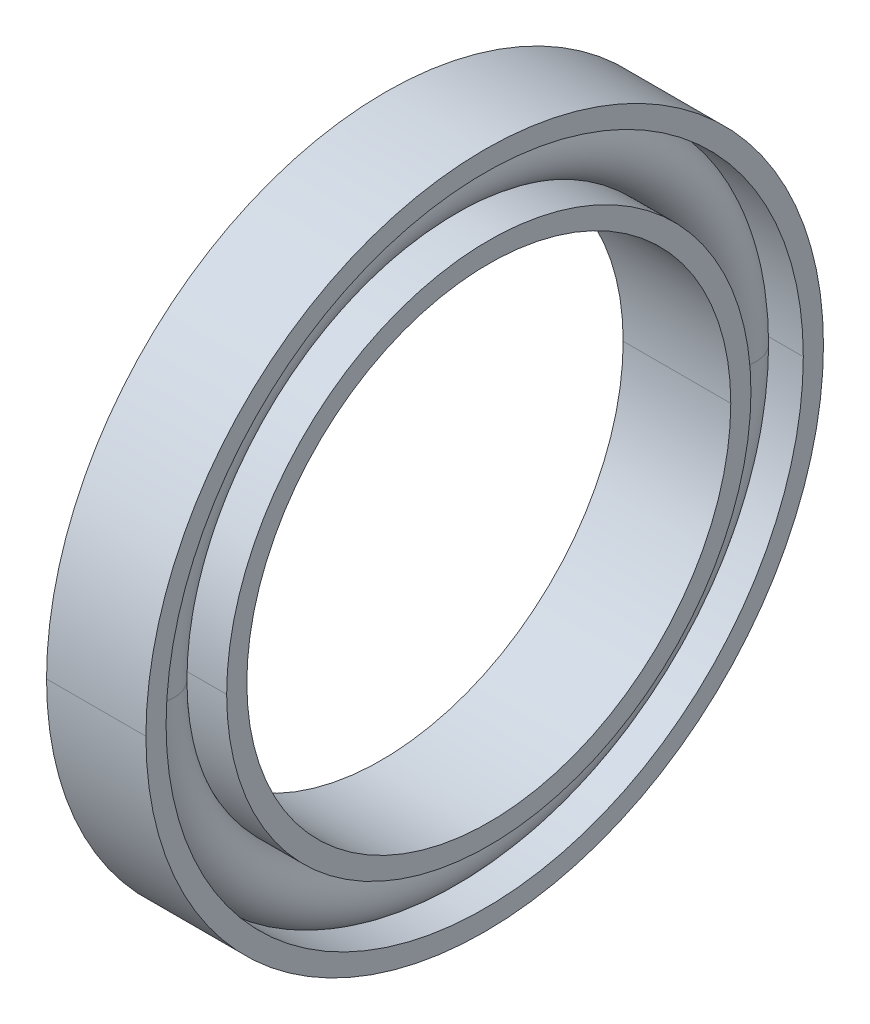
ISO-10303-21;
HEADER;
FILE_DESCRIPTION(('STEP AP214'),'2;1');
FILE_NAME('part.step','',(''),(''),'','','');
FILE_SCHEMA(('AUTOMOTIVE_DESIGN { 1 0 10303 214 1 1 1 1 }'));
ENDSEC;
DATA;
#1=APPLICATION_CONTEXT('core data for automotive mechanical design processes');
#2=APPLICATION_PROTOCOL_DEFINITION('international standard','automotive_design',2000,#1);
#3=PRODUCT_CONTEXT('',#1,'mechanical');
#4=PRODUCT('Part','Part','',(#3));
#5=PRODUCT_RELATED_PRODUCT_CATEGORY('part','',(#4));
#6=PRODUCT_DEFINITION_FORMATION('','',#4);
#7=PRODUCT_DEFINITION_CONTEXT('part definition',#1,'design');
#8=PRODUCT_DEFINITION('design','',#6,#7);
#9=PRODUCT_DEFINITION_SHAPE('','',#8);
#10=(LENGTH_UNIT() NAMED_UNIT(*) SI_UNIT(.MILLI.,.METRE.));
#11=(NAMED_UNIT(*) PLANE_ANGLE_UNIT() SI_UNIT($,.RADIAN.));
#12=(NAMED_UNIT(*) SI_UNIT($,.STERADIAN.) SOLID_ANGLE_UNIT());
#13=UNCERTAINTY_MEASURE_WITH_UNIT(LENGTH_MEASURE(1.E-05),#10,'distance_accuracy_value','');
#14=(GEOMETRIC_REPRESENTATION_CONTEXT(3) GLOBAL_UNCERTAINTY_ASSIGNED_CONTEXT((#13)) GLOBAL_UNIT_ASSIGNED_CONTEXT((#10,
#11,#12)) REPRESENTATION_CONTEXT('',''));
#15=CARTESIAN_POINT('',(0.,0.,0.));
#16=DIRECTION('',(0.,0.,1.));
#17=DIRECTION('',(1.,0.,0.));
#18=AXIS2_PLACEMENT_3D('',#15,#16,#17);
#19=CARTESIAN_POINT('',(0.154999999999996,19.,0.));
#20=DIRECTION('',(-1.,0.,0.));
#21=DIRECTION('',(0.,0.,1.));
#22=AXIS2_PLACEMENT_3D('',#19,#20,#21);
#23=PLANE('',#22);
#24=CARTESIAN_POINT('',(0.154999999999996,0.,0.));
#25=DIRECTION('',(1.,0.,0.));
#26=DIRECTION('',(0.,0.,-1.));
#27=AXIS2_PLACEMENT_3D('',#24,#25,#26);
#28=CIRCLE('',#27,16.5);
#29=CARTESIAN_POINT('',(0.154999999999996,0.,-16.5));
#30=VERTEX_POINT('',#29);
#31=CARTESIAN_POINT('',(0.154999999999996,0.,16.5));
#32=VERTEX_POINT('',#31);
#33=EDGE_CURVE('E27',#30,#32,#28,.T.);
#34=ORIENTED_EDGE('',*,*,#33,.T.);
#35=CARTESIAN_POINT('',(0.154999999999996,0.,0.));
#36=DIRECTION('',(1.,0.,0.));
#37=DIRECTION('',(0.,0.,-1.));
#38=AXIS2_PLACEMENT_3D('',#35,#36,#37);
#39=CIRCLE('',#38,16.5);
#40=EDGE_CURVE('E267',#32,#30,#39,.T.);
#41=ORIENTED_EDGE('',*,*,#40,.T.);
#42=EDGE_LOOP('',(#34,#41));
#43=FACE_BOUND('',#42,.T.);
#44=CARTESIAN_POINT('',(0.154999999999996,0.,0.));
#45=DIRECTION('',(1.,0.,0.));
#46=DIRECTION('',(0.,0.,-1.));
#47=AXIS2_PLACEMENT_3D('',#44,#45,#46);
#48=CIRCLE('',#47,19.);
#49=CARTESIAN_POINT('',(0.154999999999996,0.,-19.));
#50=VERTEX_POINT('',#49);
#51=CARTESIAN_POINT('',(0.154999999999996,0.,19.));
#52=VERTEX_POINT('',#51);
#53=EDGE_CURVE('E304',#50,#52,#48,.T.);
#54=ORIENTED_EDGE('',*,*,#53,.F.);
#55=CARTESIAN_POINT('',(0.154999999999996,0.,0.));
#56=DIRECTION('',(1.,0.,0.));
#57=DIRECTION('',(0.,0.,-1.));
#58=AXIS2_PLACEMENT_3D('',#55,#56,#57);
#59=CIRCLE('',#58,19.);
#60=EDGE_CURVE('E11',#52,#50,#59,.T.);
#61=ORIENTED_EDGE('',*,*,#60,.F.);
#62=EDGE_LOOP('',(#54,#61));
#63=FACE_BOUND('',#62,.T.);
#64=ADVANCED_FACE('F16',(#43,#63),#23,.T.);
#65=CARTESIAN_POINT('',(0.,0.,0.));
#66=DIRECTION('',(1.,0.,0.));
#67=DIRECTION('',(0.,0.,-1.));
#68=AXIS2_PLACEMENT_3D('',#65,#66,#67);
#69=CYLINDRICAL_SURFACE('',#68,19.);
#70=DIRECTION('',(1.,0.,0.));
#71=VECTOR('',#70,1.);
#72=CARTESIAN_POINT('',(0.,0.,19.));
#73=LINE('',#72,#71);
#74=CARTESIAN_POINT('',(1.47600997509336,0.,19.));
#75=VERTEX_POINT('',#74);
#76=EDGE_CURVE('E300',#52,#75,#73,.T.);
#77=ORIENTED_EDGE('',*,*,#76,.F.);
#78=ORIENTED_EDGE('',*,*,#60,.T.);
#79=DIRECTION('',(1.,0.,0.));
#80=VECTOR('',#79,1.);
#81=CARTESIAN_POINT('',(0.,0.,-19.));
#82=LINE('',#81,#80);
#83=CARTESIAN_POINT('',(1.47600997509336,0.,-19.));
#84=VERTEX_POINT('',#83);
#85=EDGE_CURVE('E271',#50,#84,#82,.T.);
#86=ORIENTED_EDGE('',*,*,#85,.T.);
#87=CARTESIAN_POINT('',(1.47600997509336,0.,0.));
#88=DIRECTION('',(1.,0.,0.));
#89=DIRECTION('',(0.,0.,-1.));
#90=AXIS2_PLACEMENT_3D('',#87,#88,#89);
#91=CIRCLE('',#90,19.);
#92=EDGE_CURVE('E158',#75,#84,#91,.T.);
#93=ORIENTED_EDGE('',*,*,#92,.F.);
#94=EDGE_LOOP('',(#77,#78,#86,#93));
#95=FACE_BOUND('',#94,.T.);
#96=ADVANCED_FACE('F350',(#95),#69,.T.);
#97=CARTESIAN_POINT('',(0.,0.,0.));
#98=DIRECTION('',(1.,0.,0.));
#99=DIRECTION('',(0.,0.,-1.));
#100=AXIS2_PLACEMENT_3D('',#97,#98,#99);
#101=CYLINDRICAL_SURFACE('',#100,16.5);
#102=DIRECTION('',(1.,0.,0.));
#103=VECTOR('',#102,1.);
#104=CARTESIAN_POINT('',(0.,0.,16.5));
#105=LINE('',#104,#103);
#106=CARTESIAN_POINT('',(1.9947424268866,0.,16.5));
#107=VERTEX_POINT('',#106);
#108=EDGE_CURVE('E194',#32,#107,#105,.T.);
#109=ORIENTED_EDGE('',*,*,#108,.F.);
#110=ORIENTED_EDGE('',*,*,#33,.F.);
#111=DIRECTION('',(1.,0.,0.));
#112=VECTOR('',#111,1.);
#113=CARTESIAN_POINT('',(0.,0.,-16.5));
#114=LINE('',#113,#112);
#115=CARTESIAN_POINT('',(1.9947424268866,0.,-16.5));
#116=VERTEX_POINT('',#115);
#117=EDGE_CURVE('E272',#30,#116,#114,.T.);
#118=ORIENTED_EDGE('',*,*,#117,.T.);
#119=CARTESIAN_POINT('',(1.9947424268866,0.,0.));
#120=DIRECTION('',(-1.,0.,0.));
#121=DIRECTION('',(0.,0.,-1.));
#122=AXIS2_PLACEMENT_3D('',#119,#120,#121);
#123=CIRCLE('',#122,16.5);
#124=EDGE_CURVE('E166',#107,#116,#123,.T.);
#125=ORIENTED_EDGE('',*,*,#124,.F.);
#126=EDGE_LOOP('',(#109,#110,#118,#125));
#127=FACE_BOUND('',#126,.T.);
#128=ADVANCED_FACE('F356',(#127),#101,.F.);
#129=CARTESIAN_POINT('',(-0.254999999999995,15.,0.));
#130=DIRECTION('',(1.,0.,0.));
#131=DIRECTION('',(0.,1.,0.));
#132=AXIS2_PLACEMENT_3D('',#129,#130,#131);
#133=PLANE('',#132);
#134=CARTESIAN_POINT('',(-0.254999999999995,0.,0.));
#135=DIRECTION('',(-1.,0.,0.));
#136=DIRECTION('',(0.,0.,1.));
#137=AXIS2_PLACEMENT_3D('',#134,#135,#136);
#138=CIRCLE('',#137,15.);
#139=CARTESIAN_POINT('',(-0.254999999999995,0.,15.));
#140=VERTEX_POINT('',#139);
#141=CARTESIAN_POINT('',(-0.254999999999995,0.,-15.));
#142=VERTEX_POINT('',#141);
#143=EDGE_CURVE('E104',#140,#142,#138,.T.);
#144=ORIENTED_EDGE('',*,*,#143,.F.);
#145=CARTESIAN_POINT('',(-0.254999999999995,0.,0.));
#146=DIRECTION('',(-1.,0.,0.));
#147=DIRECTION('',(0.,0.,1.));
#148=AXIS2_PLACEMENT_3D('',#145,#146,#147);
#149=CIRCLE('',#148,15.);
#150=EDGE_CURVE('E295',#142,#140,#149,.T.);
#151=ORIENTED_EDGE('',*,*,#150,.F.);
#152=EDGE_LOOP('',(#144,#151));
#153=FACE_BOUND('',#152,.T.);
#154=CARTESIAN_POINT('',(-0.254999999999995,0.,0.));
#155=DIRECTION('',(-1.,0.,0.));
#156=DIRECTION('',(0.,0.,1.));
#157=AXIS2_PLACEMENT_3D('',#154,#155,#156);
#158=CIRCLE('',#157,16.25);
#159=CARTESIAN_POINT('',(-0.254999999999995,0.,16.25));
#160=VERTEX_POINT('',#159);
#161=CARTESIAN_POINT('',(-0.254999999999995,0.,-16.25));
#162=VERTEX_POINT('',#161);
#163=EDGE_CURVE('E178',#160,#162,#158,.T.);
#164=ORIENTED_EDGE('',*,*,#163,.T.);
#165=CARTESIAN_POINT('',(-0.254999999999995,0.,0.));
#166=DIRECTION('',(-1.,0.,0.));
#167=DIRECTION('',(0.,0.,1.));
#168=AXIS2_PLACEMENT_3D('',#165,#166,#167);
#169=CIRCLE('',#168,16.25);
#170=EDGE_CURVE('E173',#162,#160,#169,.T.);
#171=ORIENTED_EDGE('',*,*,#170,.T.);
#172=EDGE_LOOP('',(#164,#171));
#173=FACE_BOUND('',#172,.T.);
#174=ADVANCED_FACE('F18',(#153,#173),#133,.F.);
#175=CARTESIAN_POINT('',(6.415,15.,0.));
#176=DIRECTION('',(-1.,0.,0.));
#177=DIRECTION('',(0.,0.,1.));
#178=AXIS2_PLACEMENT_3D('',#175,#176,#177);
#179=PLANE('',#178);
#180=CARTESIAN_POINT('',(6.415,0.,0.));
#181=DIRECTION('',(-1.,0.,0.));
#182=DIRECTION('',(0.,0.,1.));
#183=AXIS2_PLACEMENT_3D('',#180,#181,#182);
#184=CIRCLE('',#183,15.);
#185=CARTESIAN_POINT('',(6.415,0.,15.));
#186=VERTEX_POINT('',#185);
#187=CARTESIAN_POINT('',(6.415,0.,-15.));
#188=VERTEX_POINT('',#187);
#189=EDGE_CURVE('E224',#186,#188,#184,.T.);
#190=ORIENTED_EDGE('',*,*,#189,.T.);
#191=CARTESIAN_POINT('',(6.415,0.,0.));
#192=DIRECTION('',(-1.,0.,0.));
#193=DIRECTION('',(0.,0.,1.));
#194=AXIS2_PLACEMENT_3D('',#191,#192,#193);
#195=CIRCLE('',#194,15.);
#196=EDGE_CURVE('E275',#188,#186,#195,.T.);
#197=ORIENTED_EDGE('',*,*,#196,.T.);
#198=EDGE_LOOP('',(#190,#197));
#199=FACE_BOUND('',#198,.T.);
#200=CARTESIAN_POINT('',(6.415,0.,0.));
#201=DIRECTION('',(-1.,0.,0.));
#202=DIRECTION('',(0.,0.,1.));
#203=AXIS2_PLACEMENT_3D('',#200,#201,#202);
#204=CIRCLE('',#203,16.25);
#205=CARTESIAN_POINT('',(6.415,0.,16.25));
#206=VERTEX_POINT('',#205);
#207=CARTESIAN_POINT('',(6.415,0.,-16.25));
#208=VERTEX_POINT('',#207);
#209=EDGE_CURVE('E20',#206,#208,#204,.T.);
#210=ORIENTED_EDGE('',*,*,#209,.F.);
#211=CARTESIAN_POINT('',(6.415,0.,0.));
#212=DIRECTION('',(-1.,0.,0.));
#213=DIRECTION('',(0.,0.,1.));
#214=AXIS2_PLACEMENT_3D('',#211,#212,#213);
#215=CIRCLE('',#214,16.25);
#216=EDGE_CURVE('E89',#208,#206,#215,.T.);
#217=ORIENTED_EDGE('',*,*,#216,.F.);
#218=EDGE_LOOP('',(#210,#217));
#219=FACE_BOUND('',#218,.T.);
#220=ADVANCED_FACE('F372',(#199,#219),#179,.F.);
#221=CARTESIAN_POINT('',(0.,0.,0.));
#222=DIRECTION('',(-1.,0.,0.));
#223=DIRECTION('',(0.,0.,1.));
#224=AXIS2_PLACEMENT_3D('',#221,#222,#223);
#225=CYLINDRICAL_SURFACE('',#224,15.);
#226=DIRECTION('',(-1.,0.,0.));
#227=VECTOR('',#226,1.);
#228=CARTESIAN_POINT('',(0.,0.,-15.));
#229=LINE('',#228,#227);
#230=EDGE_CURVE('E839',#188,#142,#229,.T.);
#231=ORIENTED_EDGE('',*,*,#230,.F.);
#232=ORIENTED_EDGE('',*,*,#189,.F.);
#233=DIRECTION('',(-1.,0.,0.));
#234=VECTOR('',#233,1.);
#235=CARTESIAN_POINT('',(0.,0.,15.));
#236=LINE('',#235,#234);
#237=EDGE_CURVE('E292',#186,#140,#236,.T.);
#238=ORIENTED_EDGE('',*,*,#237,.T.);
#239=ORIENTED_EDGE('',*,*,#143,.T.);
#240=EDGE_LOOP('',(#231,#232,#238,#239));
#241=FACE_BOUND('',#240,.T.);
#242=ADVANCED_FACE('F374',(#241),#225,.F.);
#243=CARTESIAN_POINT('',(0.,0.,0.));
#244=DIRECTION('',(-1.,0.,0.));
#245=DIRECTION('',(0.,0.,1.));
#246=AXIS2_PLACEMENT_3D('',#243,#244,#245);
#247=CYLINDRICAL_SURFACE('',#246,16.25);
#248=DIRECTION('',(-1.,0.,0.));
#249=VECTOR('',#248,1.);
#250=CARTESIAN_POINT('',(0.,0.,-16.25));
#251=LINE('',#250,#249);
#252=CARTESIAN_POINT('',(3.67227020860415,0.,-16.25));
#253=VERTEX_POINT('',#252);
#254=EDGE_CURVE('E724',#208,#253,#251,.T.);
#255=ORIENTED_EDGE('',*,*,#254,.F.);
#256=ORIENTED_EDGE('',*,*,#216,.T.);
#257=DIRECTION('',(-1.,0.,0.));
#258=VECTOR('',#257,1.);
#259=CARTESIAN_POINT('',(0.,0.,16.25));
#260=LINE('',#259,#258);
#261=CARTESIAN_POINT('',(3.67227020860415,0.,16.25));
#262=VERTEX_POINT('',#261);
#263=EDGE_CURVE('E183',#206,#262,#260,.T.);
#264=ORIENTED_EDGE('',*,*,#263,.T.);
#265=CARTESIAN_POINT('',(3.67227020860415,0.,0.));
#266=DIRECTION('',(1.,0.,0.));
#267=DIRECTION('',(0.,0.,1.));
#268=AXIS2_PLACEMENT_3D('',#265,#266,#267);
#269=CIRCLE('',#268,16.25);
#270=EDGE_CURVE('E223',#262,#253,#269,.T.);
#271=ORIENTED_EDGE('',*,*,#270,.T.);
#272=EDGE_LOOP('',(#255,#256,#264,#271));
#273=FACE_BOUND('',#272,.T.);
#274=ADVANCED_FACE('F345',(#273),#247,.T.);
#275=CARTESIAN_POINT('',(0.,0.,0.));
#276=DIRECTION('',(-1.,0.,0.));
#277=DIRECTION('',(0.,0.,1.));
#278=AXIS2_PLACEMENT_3D('',#275,#276,#277);
#279=CYLINDRICAL_SURFACE('',#278,16.25);
#280=DIRECTION('',(-1.,0.,0.));
#281=VECTOR('',#280,1.);
#282=CARTESIAN_POINT('',(0.,0.,-16.25));
#283=LINE('',#282,#281);
#284=CARTESIAN_POINT('',(2.48772979139585,0.,-16.25));
#285=VERTEX_POINT('',#284);
#286=EDGE_CURVE('E171',#285,#162,#283,.T.);
#287=ORIENTED_EDGE('',*,*,#286,.F.);
#288=CARTESIAN_POINT('',(2.48772979139585,0.,0.));
#289=DIRECTION('',(-1.,0.,0.));
#290=DIRECTION('',(0.,0.,-1.));
#291=AXIS2_PLACEMENT_3D('',#288,#289,#290);
#292=CIRCLE('',#291,16.25);
#293=CARTESIAN_POINT('',(2.48772979139585,0.,16.25));
#294=VERTEX_POINT('',#293);
#295=EDGE_CURVE('E145',#285,#294,#292,.T.);
#296=ORIENTED_EDGE('',*,*,#295,.T.);
#297=DIRECTION('',(-1.,0.,0.));
#298=VECTOR('',#297,1.);
#299=CARTESIAN_POINT('',(0.,0.,16.25));
#300=LINE('',#299,#298);
#301=EDGE_CURVE('E181',#294,#160,#300,.T.);
#302=ORIENTED_EDGE('',*,*,#301,.T.);
#303=ORIENTED_EDGE('',*,*,#170,.F.);
#304=EDGE_LOOP('',(#287,#296,#302,#303));
#305=FACE_BOUND('',#304,.T.);
#306=ADVANCED_FACE('F172',(#305),#279,.T.);
#307=CARTESIAN_POINT('',(6.16,21.,0.));
#308=DIRECTION('',(-1.,0.,0.));
#309=DIRECTION('',(0.,0.,1.));
#310=AXIS2_PLACEMENT_3D('',#307,#308,#309);
#311=PLANE('',#310);
#312=CARTESIAN_POINT('',(6.16,0.,0.));
#313=DIRECTION('',(-1.,0.,0.));
#314=DIRECTION('',(0.,0.,1.));
#315=AXIS2_PLACEMENT_3D('',#312,#313,#314);
#316=CIRCLE('',#315,19.75);
#317=CARTESIAN_POINT('',(6.16,0.,19.75));
#318=VERTEX_POINT('',#317);
#319=CARTESIAN_POINT('',(6.16,0.,-19.75));
#320=VERTEX_POINT('',#319);
#321=EDGE_CURVE('E222',#318,#320,#316,.T.);
#322=ORIENTED_EDGE('',*,*,#321,.T.);
#323=CARTESIAN_POINT('',(6.16,0.,0.));
#324=DIRECTION('',(-1.,0.,0.));
#325=DIRECTION('',(0.,0.,1.));
#326=AXIS2_PLACEMENT_3D('',#323,#324,#325);
#327=CIRCLE('',#326,19.75);
#328=EDGE_CURVE('E332',#320,#318,#327,.T.);
#329=ORIENTED_EDGE('',*,*,#328,.T.);
#330=EDGE_LOOP('',(#322,#329));
#331=FACE_BOUND('',#330,.T.);
#332=CARTESIAN_POINT('',(6.16,0.,0.));
#333=DIRECTION('',(-1.,0.,0.));
#334=DIRECTION('',(0.,0.,1.));
#335=AXIS2_PLACEMENT_3D('',#332,#333,#334);
#336=CIRCLE('',#335,21.);
#337=CARTESIAN_POINT('',(6.16,0.,21.));
#338=VERTEX_POINT('',#337);
#339=CARTESIAN_POINT('',(6.16,0.,-21.));
#340=VERTEX_POINT('',#339);
#341=EDGE_CURVE('E196',#338,#340,#336,.T.);
#342=ORIENTED_EDGE('',*,*,#341,.F.);
#343=CARTESIAN_POINT('',(6.16,0.,0.));
#344=DIRECTION('',(-1.,0.,0.));
#345=DIRECTION('',(0.,0.,1.));
#346=AXIS2_PLACEMENT_3D('',#343,#344,#345);
#347=CIRCLE('',#346,21.);
#348=EDGE_CURVE('E216',#340,#338,#347,.T.);
#349=ORIENTED_EDGE('',*,*,#348,.F.);
#350=EDGE_LOOP('',(#342,#349));
#351=FACE_BOUND('',#350,.T.);
#352=ADVANCED_FACE('F334',(#331,#351),#311,.F.);
#353=CARTESIAN_POINT('',(0.,0.,0.));
#354=DIRECTION('',(-1.,0.,0.));
#355=DIRECTION('',(0.,0.,1.));
#356=AXIS2_PLACEMENT_3D('',#353,#354,#355);
#357=CYLINDRICAL_SURFACE('',#356,21.);
#358=DIRECTION('',(-1.,0.,0.));
#359=VECTOR('',#358,1.);
#360=CARTESIAN_POINT('',(0.,0.,-21.));
#361=LINE('',#360,#359);
#362=CARTESIAN_POINT('',(0.,0.,-21.));
#363=VERTEX_POINT('',#362);
#364=EDGE_CURVE('E198',#340,#363,#361,.T.);
#365=ORIENTED_EDGE('',*,*,#364,.F.);
#366=ORIENTED_EDGE('',*,*,#348,.T.);
#367=DIRECTION('',(-1.,0.,0.));
#368=VECTOR('',#367,1.);
#369=CARTESIAN_POINT('',(0.,0.,21.));
#370=LINE('',#369,#368);
#371=CARTESIAN_POINT('',(0.,0.,21.));
#372=VERTEX_POINT('',#371);
#373=EDGE_CURVE('E280',#338,#372,#370,.T.);
#374=ORIENTED_EDGE('',*,*,#373,.T.);
#375=CARTESIAN_POINT('',(0.,0.,0.));
#376=DIRECTION('',(-1.,0.,0.));
#377=DIRECTION('',(0.,0.,1.));
#378=AXIS2_PLACEMENT_3D('',#375,#376,#377);
#379=CIRCLE('',#378,21.);
#380=EDGE_CURVE('E257',#363,#372,#379,.T.);
#381=ORIENTED_EDGE('',*,*,#380,.F.);
#382=EDGE_LOOP('',(#365,#366,#374,#381));
#383=FACE_BOUND('',#382,.T.);
#384=ADVANCED_FACE('F321',(#383),#357,.T.);
#385=CARTESIAN_POINT('',(0.,19.75,0.));
#386=DIRECTION('',(1.,0.,0.));
#387=DIRECTION('',(0.,1.,0.));
#388=AXIS2_PLACEMENT_3D('',#385,#386,#387);
#389=PLANE('',#388);
#390=CARTESIAN_POINT('',(0.,0.,0.));
#391=DIRECTION('',(-1.,0.,0.));
#392=DIRECTION('',(0.,0.,1.));
#393=AXIS2_PLACEMENT_3D('',#390,#391,#392);
#394=CIRCLE('',#393,19.75);
#395=CARTESIAN_POINT('',(0.,0.,19.75));
#396=VERTEX_POINT('',#395);
#397=CARTESIAN_POINT('',(0.,0.,-19.75));
#398=VERTEX_POINT('',#397);
#399=EDGE_CURVE('E41',#396,#398,#394,.T.);
#400=ORIENTED_EDGE('',*,*,#399,.F.);
#401=CARTESIAN_POINT('',(0.,0.,0.));
#402=DIRECTION('',(-1.,0.,0.));
#403=DIRECTION('',(0.,0.,1.));
#404=AXIS2_PLACEMENT_3D('',#401,#402,#403);
#405=CIRCLE('',#404,19.75);
#406=EDGE_CURVE('E245',#398,#396,#405,.T.);
#407=ORIENTED_EDGE('',*,*,#406,.F.);
#408=EDGE_LOOP('',(#400,#407));
#409=FACE_BOUND('',#408,.T.);
#410=CARTESIAN_POINT('',(0.,0.,0.));
#411=DIRECTION('',(-1.,0.,0.));
#412=DIRECTION('',(0.,0.,1.));
#413=AXIS2_PLACEMENT_3D('',#410,#411,#412);
#414=CIRCLE('',#413,21.);
#415=EDGE_CURVE('E253',#372,#363,#414,.T.);
#416=ORIENTED_EDGE('',*,*,#415,.T.);
#417=ORIENTED_EDGE('',*,*,#380,.T.);
#418=EDGE_LOOP('',(#416,#417));
#419=FACE_BOUND('',#418,.T.);
#420=ADVANCED_FACE('F343',(#409,#419),#389,.F.);
#421=CARTESIAN_POINT('',(0.,0.,0.));
#422=DIRECTION('',(-1.,0.,0.));
#423=DIRECTION('',(0.,0.,1.));
#424=AXIS2_PLACEMENT_3D('',#421,#422,#423);
#425=CYLINDRICAL_SURFACE('',#424,19.75);
#426=DIRECTION('',(-1.,0.,0.));
#427=VECTOR('',#426,1.);
#428=CARTESIAN_POINT('',(0.,0.,-19.75));
#429=LINE('',#428,#427);
#430=CARTESIAN_POINT('',(3.82416664800299,0.,-19.75));
#431=VERTEX_POINT('',#430);
#432=EDGE_CURVE('E220',#320,#431,#429,.T.);
#433=ORIENTED_EDGE('',*,*,#432,.F.);
#434=ORIENTED_EDGE('',*,*,#321,.F.);
#435=DIRECTION('',(-1.,0.,0.));
#436=VECTOR('',#435,1.);
#437=CARTESIAN_POINT('',(0.,0.,19.75));
#438=LINE('',#437,#436);
#439=CARTESIAN_POINT('',(3.82416664800299,0.,19.75));
#440=VERTEX_POINT('',#439);
#441=EDGE_CURVE('E200',#318,#440,#438,.T.);
#442=ORIENTED_EDGE('',*,*,#441,.T.);
#443=CARTESIAN_POINT('',(3.82416664800299,0.,0.));
#444=DIRECTION('',(1.,0.,0.));
#445=DIRECTION('',(0.,0.,1.));
#446=AXIS2_PLACEMENT_3D('',#443,#444,#445);
#447=CIRCLE('',#446,19.75);
#448=EDGE_CURVE('E281',#431,#440,#447,.T.);
#449=ORIENTED_EDGE('',*,*,#448,.F.);
#450=EDGE_LOOP('',(#433,#434,#442,#449));
#451=FACE_BOUND('',#450,.T.);
#452=ADVANCED_FACE('F363',(#451),#425,.F.);
#453=CARTESIAN_POINT('',(0.,0.,0.));
#454=DIRECTION('',(-1.,0.,0.));
#455=DIRECTION('',(0.,0.,1.));
#456=AXIS2_PLACEMENT_3D('',#453,#454,#455);
#457=CYLINDRICAL_SURFACE('',#456,19.75);
#458=DIRECTION('',(-1.,0.,0.));
#459=VECTOR('',#458,1.);
#460=CARTESIAN_POINT('',(0.,0.,-19.75));
#461=LINE('',#460,#459);
#462=CARTESIAN_POINT('',(2.33583335199702,0.,-19.75));
#463=VERTEX_POINT('',#462);
#464=EDGE_CURVE('E249',#463,#398,#461,.T.);
#465=ORIENTED_EDGE('',*,*,#464,.F.);
#466=CARTESIAN_POINT('',(2.33583335199702,0.,0.));
#467=DIRECTION('',(-1.,0.,0.));
#468=DIRECTION('',(0.,0.,-1.));
#469=AXIS2_PLACEMENT_3D('',#466,#467,#468);
#470=CIRCLE('',#469,19.75);
#471=CARTESIAN_POINT('',(2.33583335199702,0.,19.75));
#472=VERTEX_POINT('',#471);
#473=EDGE_CURVE('E208',#472,#463,#470,.T.);
#474=ORIENTED_EDGE('',*,*,#473,.F.);
#475=DIRECTION('',(-1.,0.,0.));
#476=VECTOR('',#475,1.);
#477=CARTESIAN_POINT('',(0.,0.,19.75));
#478=LINE('',#477,#476);
#479=EDGE_CURVE('E248',#472,#396,#478,.T.);
#480=ORIENTED_EDGE('',*,*,#479,.T.);
#481=ORIENTED_EDGE('',*,*,#399,.T.);
#482=EDGE_LOOP('',(#465,#474,#480,#481));
#483=FACE_BOUND('',#482,.T.);
#484=ADVANCED_FACE('F398',(#483),#457,.F.);
#485=CARTESIAN_POINT('',(3.08,0.,0.));
#486=DIRECTION('',(-1.,0.,0.));
#487=DIRECTION('',(0.,0.,1.));
#488=AXIS2_PLACEMENT_3D('',#485,#486,#487);
#489=TOROIDAL_SURFACE('',#488,18.029,1.875);
#490=CARTESIAN_POINT('',(3.08,0.,-18.029));
#491=DIRECTION('',(0.,1.,0.));
#492=DIRECTION('',(0.,0.,1.));
#493=AXIS2_PLACEMENT_3D('',#490,#491,#492);
#494=CIRCLE('',#493,1.875);
#495=EDGE_CURVE('E285',#253,#431,#494,.T.);
#496=ORIENTED_EDGE('',*,*,#495,.F.);
#497=ORIENTED_EDGE('',*,*,#270,.F.);
#498=CARTESIAN_POINT('',(3.08,0.,18.029));
#499=DIRECTION('',(0.,-1.,0.));
#500=DIRECTION('',(0.,0.,-1.));
#501=AXIS2_PLACEMENT_3D('',#498,#499,#500);
#502=CIRCLE('',#501,1.875);
#503=EDGE_CURVE('E212',#262,#440,#502,.T.);
#504=ORIENTED_EDGE('',*,*,#503,.T.);
#505=CARTESIAN_POINT('',(3.82416664800299,0.,0.));
#506=DIRECTION('',(1.,0.,0.));
#507=DIRECTION('',(0.,0.,1.));
#508=AXIS2_PLACEMENT_3D('',#505,#506,#507);
#509=CIRCLE('',#508,19.75);
#510=EDGE_CURVE('E205',#440,#431,#509,.T.);
#511=ORIENTED_EDGE('',*,*,#510,.T.);
#512=EDGE_LOOP('',(#496,#497,#504,#511));
#513=FACE_BOUND('',#512,.T.);
#514=ADVANCED_FACE('F631',(#513),#489,.T.);
#515=CARTESIAN_POINT('',(3.08,0.,0.));
#516=DIRECTION('',(-1.,0.,0.));
#517=DIRECTION('',(0.,0.,1.));
#518=AXIS2_PLACEMENT_3D('',#515,#516,#517);
#519=TOROIDAL_SURFACE('',#518,18.029,1.875);
#520=CARTESIAN_POINT('',(3.08,0.,-18.029));
#521=DIRECTION('',(0.,1.,0.));
#522=DIRECTION('',(0.,0.,1.));
#523=AXIS2_PLACEMENT_3D('',#520,#521,#522);
#524=CIRCLE('',#523,1.875);
#525=EDGE_CURVE('E211',#463,#84,#524,.T.);
#526=ORIENTED_EDGE('',*,*,#525,.F.);
#527=CARTESIAN_POINT('',(2.33583335199702,0.,0.));
#528=DIRECTION('',(-1.,0.,0.));
#529=DIRECTION('',(0.,0.,-1.));
#530=AXIS2_PLACEMENT_3D('',#527,#528,#529);
#531=CIRCLE('',#530,19.75);
#532=EDGE_CURVE('E204',#463,#472,#531,.T.);
#533=ORIENTED_EDGE('',*,*,#532,.T.);
#534=CARTESIAN_POINT('',(3.08,0.,18.029));
#535=DIRECTION('',(0.,-1.,0.));
#536=DIRECTION('',(0.,0.,-1.));
#537=AXIS2_PLACEMENT_3D('',#534,#535,#536);
#538=CIRCLE('',#537,1.875);
#539=EDGE_CURVE('E264',#472,#75,#538,.T.);
#540=ORIENTED_EDGE('',*,*,#539,.T.);
#541=ORIENTED_EDGE('',*,*,#92,.T.);
#542=EDGE_LOOP('',(#526,#533,#540,#541));
#543=FACE_BOUND('',#542,.T.);
#544=ADVANCED_FACE('F401',(#543),#519,.T.);
#545=CARTESIAN_POINT('',(3.08,0.,0.));
#546=DIRECTION('',(-1.,0.,0.));
#547=DIRECTION('',(0.,0.,1.));
#548=AXIS2_PLACEMENT_3D('',#545,#546,#547);
#549=TOROIDAL_SURFACE('',#548,18.029,1.875);
#550=CARTESIAN_POINT('',(3.08,0.,-18.029));
#551=DIRECTION('',(0.,1.,0.));
#552=DIRECTION('',(0.,0.,1.));
#553=AXIS2_PLACEMENT_3D('',#550,#551,#552);
#554=CIRCLE('',#553,1.875);
#555=EDGE_CURVE('E153',#116,#285,#554,.T.);
#556=ORIENTED_EDGE('',*,*,#555,.F.);
#557=CARTESIAN_POINT('',(1.9947424268866,0.,0.));
#558=DIRECTION('',(-1.,0.,0.));
#559=DIRECTION('',(0.,0.,-1.));
#560=AXIS2_PLACEMENT_3D('',#557,#558,#559);
#561=CIRCLE('',#560,16.5);
#562=EDGE_CURVE('E276',#116,#107,#561,.T.);
#563=ORIENTED_EDGE('',*,*,#562,.T.);
#564=CARTESIAN_POINT('',(3.08,0.,18.029));
#565=DIRECTION('',(0.,-1.,0.));
#566=DIRECTION('',(0.,0.,-1.));
#567=AXIS2_PLACEMENT_3D('',#564,#565,#566);
#568=CIRCLE('',#567,1.875);
#569=EDGE_CURVE('E155',#107,#294,#568,.T.);
#570=ORIENTED_EDGE('',*,*,#569,.T.);
#571=ORIENTED_EDGE('',*,*,#295,.F.);
#572=EDGE_LOOP('',(#556,#563,#570,#571));
#573=FACE_BOUND('',#572,.T.);
#574=ADVANCED_FACE('F151',(#573),#549,.T.);
#575=CARTESIAN_POINT('',(3.08,0.,0.));
#576=DIRECTION('',(-1.,0.,0.));
#577=DIRECTION('',(0.,0.,1.));
#578=AXIS2_PLACEMENT_3D('',#575,#576,#577);
#579=TOROIDAL_SURFACE('',#578,18.029,1.875);
#580=ORIENTED_EDGE('',*,*,#124,.T.);
#581=ORIENTED_EDGE('',*,*,#555,.T.);
#582=CARTESIAN_POINT('',(2.48772979139585,0.,0.));
#583=DIRECTION('',(-1.,0.,0.));
#584=DIRECTION('',(0.,0.,-1.));
#585=AXIS2_PLACEMENT_3D('',#582,#583,#584);
#586=CIRCLE('',#585,16.25);
#587=EDGE_CURVE('E164',#294,#285,#586,.T.);
#588=ORIENTED_EDGE('',*,*,#587,.F.);
#589=ORIENTED_EDGE('',*,*,#569,.F.);
#590=EDGE_LOOP('',(#580,#581,#588,#589));
#591=FACE_BOUND('',#590,.T.);
#592=ADVANCED_FACE('F162',(#591),#579,.T.);
#593=CARTESIAN_POINT('',(3.08,0.,0.));
#594=DIRECTION('',(-1.,0.,0.));
#595=DIRECTION('',(0.,0.,1.));
#596=AXIS2_PLACEMENT_3D('',#593,#594,#595);
#597=TOROIDAL_SURFACE('',#596,18.029,1.875);
#598=ORIENTED_EDGE('',*,*,#473,.T.);
#599=ORIENTED_EDGE('',*,*,#525,.T.);
#600=CARTESIAN_POINT('',(1.47600997509336,0.,0.));
#601=DIRECTION('',(1.,0.,0.));
#602=DIRECTION('',(0.,0.,-1.));
#603=AXIS2_PLACEMENT_3D('',#600,#601,#602);
#604=CIRCLE('',#603,19.);
#605=EDGE_CURVE('E244',#84,#75,#604,.T.);
#606=ORIENTED_EDGE('',*,*,#605,.T.);
#607=ORIENTED_EDGE('',*,*,#539,.F.);
#608=EDGE_LOOP('',(#598,#599,#606,#607));
#609=FACE_BOUND('',#608,.T.);
#610=ADVANCED_FACE('F375',(#609),#597,.T.);
#611=CARTESIAN_POINT('',(3.08,0.,0.));
#612=DIRECTION('',(-1.,0.,0.));
#613=DIRECTION('',(0.,0.,1.));
#614=AXIS2_PLACEMENT_3D('',#611,#612,#613);
#615=TOROIDAL_SURFACE('',#614,18.029,1.875);
#616=CARTESIAN_POINT('',(3.67227020860415,0.,0.));
#617=DIRECTION('',(1.,0.,0.));
#618=DIRECTION('',(0.,0.,1.));
#619=AXIS2_PLACEMENT_3D('',#616,#617,#618);
#620=CIRCLE('',#619,16.25);
#621=EDGE_CURVE('E190',#253,#262,#620,.T.);
#622=ORIENTED_EDGE('',*,*,#621,.F.);
#623=ORIENTED_EDGE('',*,*,#495,.T.);
#624=ORIENTED_EDGE('',*,*,#448,.T.);
#625=ORIENTED_EDGE('',*,*,#503,.F.);
#626=EDGE_LOOP('',(#622,#623,#624,#625));
#627=FACE_BOUND('',#626,.T.);
#628=ADVANCED_FACE('F377',(#627),#615,.T.);
#629=CARTESIAN_POINT('',(0.,0.,0.));
#630=DIRECTION('',(-1.,0.,0.));
#631=DIRECTION('',(0.,0.,1.));
#632=AXIS2_PLACEMENT_3D('',#629,#630,#631);
#633=CYLINDRICAL_SURFACE('',#632,19.75);
#634=ORIENTED_EDGE('',*,*,#532,.F.);
#635=ORIENTED_EDGE('',*,*,#464,.T.);
#636=ORIENTED_EDGE('',*,*,#406,.T.);
#637=ORIENTED_EDGE('',*,*,#479,.F.);
#638=EDGE_LOOP('',(#634,#635,#636,#637));
#639=FACE_BOUND('',#638,.T.);
#640=ADVANCED_FACE('F383',(#639),#633,.F.);
#641=CARTESIAN_POINT('',(0.,0.,0.));
#642=DIRECTION('',(-1.,0.,0.));
#643=DIRECTION('',(0.,0.,1.));
#644=AXIS2_PLACEMENT_3D('',#641,#642,#643);
#645=CYLINDRICAL_SURFACE('',#644,19.75);
#646=ORIENTED_EDGE('',*,*,#328,.F.);
#647=ORIENTED_EDGE('',*,*,#432,.T.);
#648=ORIENTED_EDGE('',*,*,#510,.F.);
#649=ORIENTED_EDGE('',*,*,#441,.F.);
#650=EDGE_LOOP('',(#646,#647,#648,#649));
#651=FACE_BOUND('',#650,.T.);
#652=ADVANCED_FACE('F596',(#651),#645,.F.);
#653=CARTESIAN_POINT('',(0.,0.,0.));
#654=DIRECTION('',(-1.,0.,0.));
#655=DIRECTION('',(0.,0.,1.));
#656=AXIS2_PLACEMENT_3D('',#653,#654,#655);
#657=CYLINDRICAL_SURFACE('',#656,21.);
#658=ORIENTED_EDGE('',*,*,#341,.T.);
#659=ORIENTED_EDGE('',*,*,#364,.T.);
#660=ORIENTED_EDGE('',*,*,#415,.F.);
#661=ORIENTED_EDGE('',*,*,#373,.F.);
#662=EDGE_LOOP('',(#658,#659,#660,#661));
#663=FACE_BOUND('',#662,.T.);
#664=ADVANCED_FACE('F330',(#663),#657,.T.);
#665=CARTESIAN_POINT('',(0.,0.,0.));
#666=DIRECTION('',(-1.,0.,0.));
#667=DIRECTION('',(0.,0.,1.));
#668=AXIS2_PLACEMENT_3D('',#665,#666,#667);
#669=CYLINDRICAL_SURFACE('',#668,16.25);
#670=ORIENTED_EDGE('',*,*,#587,.T.);
#671=ORIENTED_EDGE('',*,*,#286,.T.);
#672=ORIENTED_EDGE('',*,*,#163,.F.);
#673=ORIENTED_EDGE('',*,*,#301,.F.);
#674=EDGE_LOOP('',(#670,#671,#672,#673));
#675=FACE_BOUND('',#674,.T.);
#676=ADVANCED_FACE('F180',(#675),#669,.T.);
#677=CARTESIAN_POINT('',(0.,0.,0.));
#678=DIRECTION('',(-1.,0.,0.));
#679=DIRECTION('',(0.,0.,1.));
#680=AXIS2_PLACEMENT_3D('',#677,#678,#679);
#681=CYLINDRICAL_SURFACE('',#680,16.25);
#682=ORIENTED_EDGE('',*,*,#209,.T.);
#683=ORIENTED_EDGE('',*,*,#254,.T.);
#684=ORIENTED_EDGE('',*,*,#621,.T.);
#685=ORIENTED_EDGE('',*,*,#263,.F.);
#686=EDGE_LOOP('',(#682,#683,#684,#685));
#687=FACE_BOUND('',#686,.T.);
#688=ADVANCED_FACE('F365',(#687),#681,.T.);
#689=CARTESIAN_POINT('',(0.,0.,0.));
#690=DIRECTION('',(-1.,0.,0.));
#691=DIRECTION('',(0.,0.,1.));
#692=AXIS2_PLACEMENT_3D('',#689,#690,#691);
#693=CYLINDRICAL_SURFACE('',#692,15.);
#694=ORIENTED_EDGE('',*,*,#196,.F.);
#695=ORIENTED_EDGE('',*,*,#230,.T.);
#696=ORIENTED_EDGE('',*,*,#150,.T.);
#697=ORIENTED_EDGE('',*,*,#237,.F.);
#698=EDGE_LOOP('',(#694,#695,#696,#697));
#699=FACE_BOUND('',#698,.T.);
#700=ADVANCED_FACE('F368',(#699),#693,.F.);
#701=CARTESIAN_POINT('',(0.,0.,0.));
#702=DIRECTION('',(1.,0.,0.));
#703=DIRECTION('',(0.,0.,-1.));
#704=AXIS2_PLACEMENT_3D('',#701,#702,#703);
#705=CYLINDRICAL_SURFACE('',#704,16.5);
#706=ORIENTED_EDGE('',*,*,#40,.F.);
#707=ORIENTED_EDGE('',*,*,#108,.T.);
#708=ORIENTED_EDGE('',*,*,#562,.F.);
#709=ORIENTED_EDGE('',*,*,#117,.F.);
#710=EDGE_LOOP('',(#706,#707,#708,#709));
#711=FACE_BOUND('',#710,.T.);
#712=ADVANCED_FACE('F605',(#711),#705,.F.);
#713=CARTESIAN_POINT('',(0.,0.,0.));
#714=DIRECTION('',(1.,0.,0.));
#715=DIRECTION('',(0.,0.,-1.));
#716=AXIS2_PLACEMENT_3D('',#713,#714,#715);
#717=CYLINDRICAL_SURFACE('',#716,19.);
#718=ORIENTED_EDGE('',*,*,#53,.T.);
#719=ORIENTED_EDGE('',*,*,#76,.T.);
#720=ORIENTED_EDGE('',*,*,#605,.F.);
#721=ORIENTED_EDGE('',*,*,#85,.F.);
#722=EDGE_LOOP('',(#718,#719,#720,#721));
#723=FACE_BOUND('',#722,.T.);
#724=ADVANCED_FACE('F601',(#723),#717,.T.);
#725=CLOSED_SHELL('',(#64,#96,#128,#174,#220,#242,#274,#306,#352,#384,#420,#452,#484,#514,#544,
#574,#592,#610,#628,#640,#652,#664,#676,#688,#700,#712,#724));
#726=MANIFOLD_SOLID_BREP('B1',#725);
#727=ADVANCED_BREP_SHAPE_REPRESENTATION('',(#18,#726),#14);
#728=SHAPE_DEFINITION_REPRESENTATION(#9,#727);
ENDSEC;
END-ISO-10303-21;
